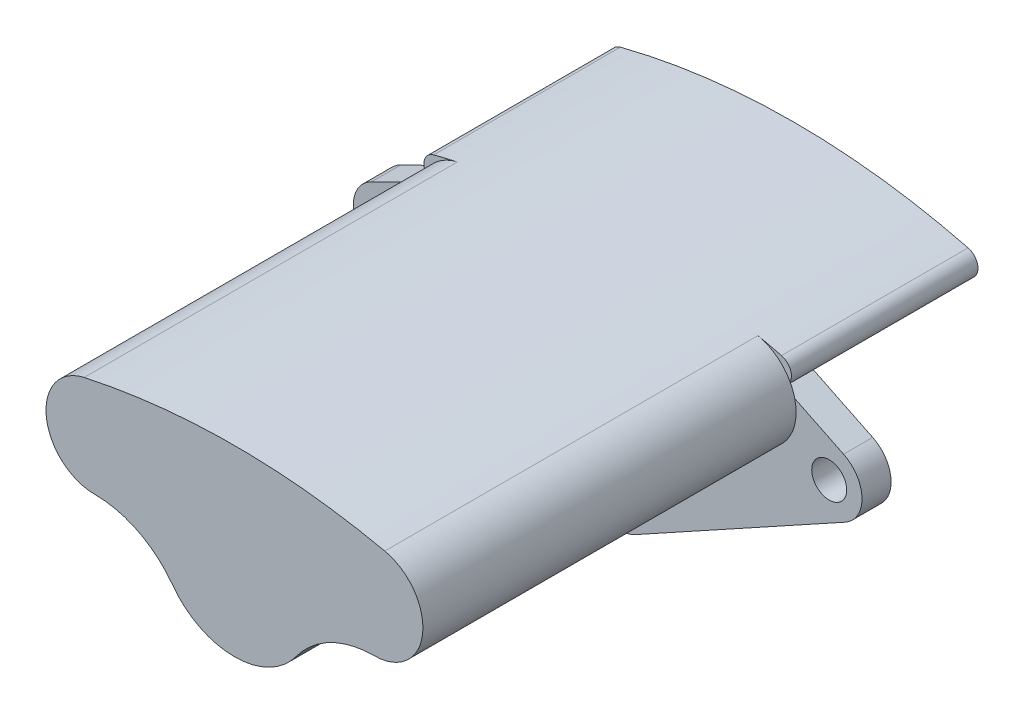
ISO-10303-21;
HEADER;
FILE_DESCRIPTION(('STEP AP214'),'2;1');
FILE_NAME('part.step','',(''),(''),'','','');
FILE_SCHEMA(('AUTOMOTIVE_DESIGN { 1 0 10303 214 1 1 1 1 }'));
ENDSEC;
DATA;
#1=APPLICATION_CONTEXT('core data for automotive mechanical design processes');
#2=APPLICATION_PROTOCOL_DEFINITION('international standard','automotive_design',2000,#1);
#3=PRODUCT_CONTEXT('',#1,'mechanical');
#4=PRODUCT('Part','Part','',(#3));
#5=PRODUCT_RELATED_PRODUCT_CATEGORY('part','',(#4));
#6=PRODUCT_DEFINITION_FORMATION('','',#4);
#7=PRODUCT_DEFINITION_CONTEXT('part definition',#1,'design');
#8=PRODUCT_DEFINITION('design','',#6,#7);
#9=PRODUCT_DEFINITION_SHAPE('','',#8);
#10=(LENGTH_UNIT() NAMED_UNIT(*) SI_UNIT(.MILLI.,.METRE.));
#11=(NAMED_UNIT(*) PLANE_ANGLE_UNIT() SI_UNIT($,.RADIAN.));
#12=(NAMED_UNIT(*) SI_UNIT($,.STERADIAN.) SOLID_ANGLE_UNIT());
#13=UNCERTAINTY_MEASURE_WITH_UNIT(LENGTH_MEASURE(1.E-05),#10,'distance_accuracy_value','');
#14=(GEOMETRIC_REPRESENTATION_CONTEXT(3) GLOBAL_UNCERTAINTY_ASSIGNED_CONTEXT((#13)) GLOBAL_UNIT_ASSIGNED_CONTEXT((#10,
#11,#12)) REPRESENTATION_CONTEXT('',''));
#15=CARTESIAN_POINT('',(0.,0.,0.));
#16=DIRECTION('',(0.,0.,1.));
#17=DIRECTION('',(1.,0.,0.));
#18=AXIS2_PLACEMENT_3D('',#15,#16,#17);
#19=CARTESIAN_POINT('',(64.2346131851022,11.3234732579478,7.9248));
#20=DIRECTION('',(-0.438064147591785,-0.898943714920285,0.));
#21=DIRECTION('',(0.898943714920285,-0.438064147591785,0.));
#22=AXIS2_PLACEMENT_3D('',#19,#20,#21);
#23=PLANE('',#22);
#24=DIRECTION('',(0.,0.,1.));
#25=VECTOR('',#24,1.);
#26=CARTESIAN_POINT('',(47.8255621165623,19.3197658509356,-42.8752));
#27=LINE('',#26,#25);
#28=CARTESIAN_POINT('',(47.8255621165623,19.3197658509356,7.9248));
#29=VERTEX_POINT('',#28);
#30=CARTESIAN_POINT('',(47.8255621165623,19.3197658509356,0.));
#31=VERTEX_POINT('',#30);
#32=EDGE_CURVE('E262',#29,#31,#27,.F.);
#33=ORIENTED_EDGE('',*,*,#32,.F.);
#34=DIRECTION('',(-0.898943714920285,0.438064147591785,0.));
#35=VECTOR('',#34,1.);
#36=CARTESIAN_POINT('',(64.2346131851022,11.3234732579478,7.9248));
#37=LINE('',#36,#35);
#38=CARTESIAN_POINT('',(50.948654549501,17.7978520739346,7.9248));
#39=VERTEX_POINT('',#38);
#40=EDGE_CURVE('E352',#39,#29,#37,.T.);
#41=ORIENTED_EDGE('',*,*,#40,.F.);
#42=CARTESIAN_POINT('',(64.2346131851022,11.3234732579478,7.9248));
#43=VERTEX_POINT('',#42);
#44=EDGE_CURVE('E355',#43,#39,#37,.T.);
#45=ORIENTED_EDGE('',*,*,#44,.F.);
#46=DIRECTION('',(0.,0.,-1.));
#47=VECTOR('',#46,1.);
#48=CARTESIAN_POINT('',(64.2346131851022,11.3234732579478,7.9248));
#49=LINE('',#48,#47);
#50=CARTESIAN_POINT('',(64.2346131851022,11.3234732579478,0.));
#51=VERTEX_POINT('',#50);
#52=EDGE_CURVE('E415',#43,#51,#49,.T.);
#53=ORIENTED_EDGE('',*,*,#52,.T.);
#54=DIRECTION('',(-0.898943714920285,0.438064147591785,0.));
#55=VECTOR('',#54,1.);
#56=CARTESIAN_POINT('',(64.2346131851022,11.3234732579478,0.));
#57=LINE('',#56,#55);
#58=EDGE_CURVE('E384',#51,#31,#57,.T.);
#59=ORIENTED_EDGE('',*,*,#58,.T.);
#60=EDGE_LOOP('',(#33,#41,#45,#53,#59));
#61=FACE_BOUND('',#60,.T.);
#62=ADVANCED_FACE('F43',(#61),#23,.F.);
#63=CARTESIAN_POINT('',(38.1,14.7306249608711,7.9248));
#64=DIRECTION('',(0.,0.,-1.));
#65=DIRECTION('',(-1.,0.,0.));
#66=AXIS2_PLACEMENT_3D('',#63,#64,#65);
#67=CYLINDRICAL_SURFACE('',#66,8.38579943844996);
#68=DIRECTION('',(0.,0.,1.));
#69=VECTOR('',#68,1.);
#70=CARTESIAN_POINT('',(33.5739350474456,21.7901127799106,-17.4752));
#71=LINE('',#70,#69);
#72=CARTESIAN_POINT('',(33.5739350474456,21.7901127799106,0.));
#73=VERTEX_POINT('',#72);
#74=CARTESIAN_POINT('',(33.5739350474456,21.7901127799106,7.9248));
#75=VERTEX_POINT('',#74);
#76=EDGE_CURVE('E265',#73,#75,#71,.T.);
#77=ORIENTED_EDGE('',*,*,#76,.F.);
#78=CARTESIAN_POINT('',(38.1,14.7306249608711,0.));
#79=DIRECTION('',(0.,0.,1.));
#80=DIRECTION('',(1.,0.,0.));
#81=AXIS2_PLACEMENT_3D('',#78,#79,#80);
#82=CIRCLE('',#81,8.38579943844996);
#83=CARTESIAN_POINT('',(30.4611324593754,18.1902976214994,0.));
#84=VERTEX_POINT('',#83);
#85=EDGE_CURVE('E387',#73,#84,#82,.T.);
#86=ORIENTED_EDGE('',*,*,#85,.T.);
#87=DIRECTION('',(0.,0.,-1.));
#88=VECTOR('',#87,1.);
#89=CARTESIAN_POINT('',(30.4611324593754,18.1902976214994,7.9248));
#90=LINE('',#89,#88);
#91=CARTESIAN_POINT('',(30.4611324593754,18.1902976214994,7.9248));
#92=VERTEX_POINT('',#91);
#93=EDGE_CURVE('E406',#92,#84,#90,.T.);
#94=ORIENTED_EDGE('',*,*,#93,.F.);
#95=CARTESIAN_POINT('',(38.1,14.7306249608711,7.9248));
#96=DIRECTION('',(0.,0.,1.));
#97=DIRECTION('',(1.,0.,0.));
#98=AXIS2_PLACEMENT_3D('',#95,#96,#97);
#99=CIRCLE('',#98,8.38579943844996);
#100=EDGE_CURVE('E351',#75,#92,#99,.T.);
#101=ORIENTED_EDGE('',*,*,#100,.F.);
#102=EDGE_LOOP('',(#77,#86,#94,#101));
#103=FACE_BOUND('',#102,.T.);
#104=ADVANCED_FACE('F517',(#103),#67,.T.);
#105=CARTESIAN_POINT('',(-38.1,14.7306249608711,7.9248));
#106=DIRECTION('',(0.,0.,-1.));
#107=DIRECTION('',(-1.,0.,0.));
#108=AXIS2_PLACEMENT_3D('',#105,#106,#107);
#109=CYLINDRICAL_SURFACE('',#108,8.38579943844996);
#110=DIRECTION('',(0.,0.,1.));
#111=VECTOR('',#110,1.);
#112=CARTESIAN_POINT('',(-33.5739350474456,21.7901127799106,-17.4752));
#113=LINE('',#112,#111);
#114=CARTESIAN_POINT('',(-33.5739350474456,21.7901127799106,7.9248));
#115=VERTEX_POINT('',#114);
#116=CARTESIAN_POINT('',(-33.5739350474456,21.7901127799106,0.));
#117=VERTEX_POINT('',#116);
#118=EDGE_CURVE('E256',#115,#117,#113,.F.);
#119=ORIENTED_EDGE('',*,*,#118,.F.);
#120=CARTESIAN_POINT('',(-38.1,14.7306249608711,7.9248));
#121=DIRECTION('',(0.,0.,1.));
#122=DIRECTION('',(-1.,0.,0.));
#123=AXIS2_PLACEMENT_3D('',#120,#121,#122);
#124=CIRCLE('',#123,8.38579943844996);
#125=CARTESIAN_POINT('',(-30.4611324593754,18.1902976214994,7.9248));
#126=VERTEX_POINT('',#125);
#127=EDGE_CURVE('E366',#126,#115,#124,.T.);
#128=ORIENTED_EDGE('',*,*,#127,.F.);
#129=DIRECTION('',(0.,0.,-1.));
#130=VECTOR('',#129,1.);
#131=CARTESIAN_POINT('',(-30.4611324593754,18.1902976214994,7.9248));
#132=LINE('',#131,#130);
#133=CARTESIAN_POINT('',(-30.4611324593754,18.1902976214994,0.));
#134=VERTEX_POINT('',#133);
#135=EDGE_CURVE('E396',#126,#134,#132,.T.);
#136=ORIENTED_EDGE('',*,*,#135,.T.);
#137=CARTESIAN_POINT('',(-38.1,14.7306249608711,0.));
#138=DIRECTION('',(0.,0.,1.));
#139=DIRECTION('',(-1.,0.,0.));
#140=AXIS2_PLACEMENT_3D('',#137,#138,#139);
#141=CIRCLE('',#140,8.38579943844996);
#142=EDGE_CURVE('E394',#134,#117,#141,.T.);
#143=ORIENTED_EDGE('',*,*,#142,.T.);
#144=EDGE_LOOP('',(#119,#128,#136,#143));
#145=FACE_BOUND('',#144,.T.);
#146=ADVANCED_FACE('F440',(#145),#109,.T.);
#147=CARTESIAN_POINT('',(-64.2346131851022,11.3234732579478,7.9248));
#148=DIRECTION('',(0.438064147591785,-0.898943714920285,0.));
#149=DIRECTION('',(0.898943714920285,0.438064147591785,0.));
#150=AXIS2_PLACEMENT_3D('',#147,#148,#149);
#151=PLANE('',#150);
#152=DIRECTION('',(0.,0.,1.));
#153=VECTOR('',#152,1.);
#154=CARTESIAN_POINT('',(-47.8255621165623,19.3197658509356,-42.8752));
#155=LINE('',#154,#153);
#156=CARTESIAN_POINT('',(-47.8255621165623,19.3197658509356,0.));
#157=VERTEX_POINT('',#156);
#158=CARTESIAN_POINT('',(-47.8255621165623,19.3197658509356,7.9248));
#159=VERTEX_POINT('',#158);
#160=EDGE_CURVE('E249',#157,#159,#155,.T.);
#161=ORIENTED_EDGE('',*,*,#160,.F.);
#162=DIRECTION('',(-0.898943714920285,-0.438064147591785,0.));
#163=VECTOR('',#162,1.);
#164=CARTESIAN_POINT('',(-64.2346131851022,11.3234732579478,0.));
#165=LINE('',#164,#163);
#166=CARTESIAN_POINT('',(-64.2346131851022,11.3234732579478,0.));
#167=VERTEX_POINT('',#166);
#168=EDGE_CURVE('E344',#157,#167,#165,.T.);
#169=ORIENTED_EDGE('',*,*,#168,.T.);
#170=DIRECTION('',(0.,0.,-1.));
#171=VECTOR('',#170,1.);
#172=CARTESIAN_POINT('',(-64.2346131851022,11.3234732579478,7.9248));
#173=LINE('',#172,#171);
#174=CARTESIAN_POINT('',(-64.2346131851022,11.3234732579478,7.9248));
#175=VERTEX_POINT('',#174);
#176=EDGE_CURVE('E375',#175,#167,#173,.T.);
#177=ORIENTED_EDGE('',*,*,#176,.F.);
#178=DIRECTION('',(-0.898943714920285,-0.438064147591785,0.));
#179=VECTOR('',#178,1.);
#180=CARTESIAN_POINT('',(-64.2346131851022,11.3234732579478,7.9248));
#181=LINE('',#180,#179);
#182=CARTESIAN_POINT('',(-50.948654549501,17.7978520739346,7.9248));
#183=VERTEX_POINT('',#182);
#184=EDGE_CURVE('E367',#183,#175,#181,.T.);
#185=ORIENTED_EDGE('',*,*,#184,.F.);
#186=EDGE_CURVE('E369',#159,#183,#181,.T.);
#187=ORIENTED_EDGE('',*,*,#186,.F.);
#188=EDGE_LOOP('',(#161,#169,#177,#185,#187));
#189=FACE_BOUND('',#188,.T.);
#190=ADVANCED_FACE('F533',(#189),#151,.F.);
#191=CARTESIAN_POINT('',(-38.0701414873198,-5.00163867781075,7.9248));
#192=DIRECTION('',(0.,0.,1.));
#193=DIRECTION('',(1.,0.,0.));
#194=AXIS2_PLACEMENT_3D('',#191,#192,#193);
#195=PLANE('',#194);
#196=CARTESIAN_POINT('',(46.4388281649053,22.6347021845761,7.9248));
#197=DIRECTION('',(0.,0.,1.));
#198=DIRECTION('',(1.,0.,0.));
#199=AXIS2_PLACEMENT_3D('',#196,#197,#198);
#200=CIRCLE('',#199,3.59330404346313);
#201=CARTESIAN_POINT('',(49.6808459386615,21.0851362119834,7.9248));
#202=VERTEX_POINT('',#201);
#203=EDGE_CURVE('E11',#202,#29,#200,.F.);
#204=ORIENTED_EDGE('',*,*,#203,.F.);
#205=CARTESIAN_POINT('',(38.1,14.7306249608711,7.9248));
#206=DIRECTION('',(0.,0.,1.));
#207=DIRECTION('',(-1.,0.,0.));
#208=AXIS2_PLACEMENT_3D('',#205,#206,#207);
#209=CIRCLE('',#208,13.2096860634735);
#210=EDGE_CURVE('E298',#39,#202,#209,.T.);
#211=ORIENTED_EDGE('',*,*,#210,.F.);
#212=ORIENTED_EDGE('',*,*,#40,.T.);
#213=EDGE_LOOP('',(#204,#211,#212));
#214=FACE_BOUND('',#213,.T.);
#215=ADVANCED_FACE('F497',(#214),#195,.F.);
#216=CARTESIAN_POINT('',(0.,-159.197568550565,7.9248));
#217=DIRECTION('',(0.,0.,1.));
#218=DIRECTION('',(1.,0.,0.));
#219=AXIS2_PLACEMENT_3D('',#216,#217,#218);
#220=CIRCLE('',#219,184.075391913074);
#221=EDGE_CURVE('E51',#75,#115,#220,.T.);
#222=ORIENTED_EDGE('',*,*,#221,.F.);
#223=ORIENTED_EDGE('',*,*,#100,.T.);
#224=DIRECTION('',(-0.41256324886155,-0.910928957542136,0.));
#225=VECTOR('',#224,1.);
#226=CARTESIAN_POINT('',(30.4611324593754,18.1902976214994,7.9248));
#227=LINE('',#226,#225);
#228=CARTESIAN_POINT('',(19.3899277946436,-6.25463525075486,7.9248));
#229=VERTEX_POINT('',#228);
#230=EDGE_CURVE('E356',#92,#229,#227,.T.);
#231=ORIENTED_EDGE('',*,*,#230,.T.);
#232=CARTESIAN_POINT('',(38.0402829746396,-24.7339023164926,7.9248));
#233=DIRECTION('',(0.,0.,-1.));
#234=DIRECTION('',(1.,0.,0.));
#235=AXIS2_PLACEMENT_3D('',#232,#233,#234);
#236=CIRCLE('',#235,26.2548863952382);
#237=CARTESIAN_POINT('',(16.8662322023074,-9.21041580354835,7.9248));
#238=VERTEX_POINT('',#237);
#239=EDGE_CURVE('E289',#238,#229,#236,.T.);
#240=ORIENTED_EDGE('',*,*,#239,.F.);
#241=CARTESIAN_POINT('',(0.,3.15484821380376,7.9248));
#242=DIRECTION('',(0.,0.,1.));
#243=DIRECTION('',(-1.,0.,0.));
#244=AXIS2_PLACEMENT_3D('',#241,#242,#243);
#245=CIRCLE('',#244,20.9133819101784);
#246=CARTESIAN_POINT('',(-16.8662322023074,-9.21041580354834,7.9248));
#247=VERTEX_POINT('',#246);
#248=EDGE_CURVE('E290',#247,#238,#245,.T.);
#249=ORIENTED_EDGE('',*,*,#248,.F.);
#250=CARTESIAN_POINT('',(-38.0402829746396,-24.7339023164926,7.9248));
#251=DIRECTION('',(0.,0.,-1.));
#252=DIRECTION('',(-1.,0.,0.));
#253=AXIS2_PLACEMENT_3D('',#250,#251,#252);
#254=CIRCLE('',#253,26.2548863952382);
#255=CARTESIAN_POINT('',(-19.3899277946436,-6.2546352507549,7.9248));
#256=VERTEX_POINT('',#255);
#257=EDGE_CURVE('E284',#256,#247,#254,.T.);
#258=ORIENTED_EDGE('',*,*,#257,.F.);
#259=DIRECTION('',(-0.412563248861551,0.910928957542136,0.));
#260=VECTOR('',#259,1.);
#261=CARTESIAN_POINT('',(-30.4611324593754,18.1902976214994,7.9248));
#262=LINE('',#261,#260);
#263=EDGE_CURVE('E361',#256,#126,#262,.T.);
#264=ORIENTED_EDGE('',*,*,#263,.T.);
#265=ORIENTED_EDGE('',*,*,#127,.T.);
#266=EDGE_LOOP('',(#222,#223,#231,#240,#249,#258,#264,#265));
#267=FACE_BOUND('',#266,.T.);
#268=ADVANCED_FACE('F439',(#267),#195,.F.);
#269=CARTESIAN_POINT('',(-46.4388281649053,22.6347021845761,7.9248));
#270=DIRECTION('',(0.,0.,1.));
#271=DIRECTION('',(1.,0.,0.));
#272=AXIS2_PLACEMENT_3D('',#269,#270,#271);
#273=CIRCLE('',#272,3.59330404346313);
#274=CARTESIAN_POINT('',(-49.6808459386615,21.0851362119834,7.9248));
#275=VERTEX_POINT('',#274);
#276=EDGE_CURVE('E430',#159,#275,#273,.F.);
#277=ORIENTED_EDGE('',*,*,#276,.F.);
#278=ORIENTED_EDGE('',*,*,#186,.T.);
#279=CARTESIAN_POINT('',(-38.1,14.7306249608711,7.9248));
#280=DIRECTION('',(0.,0.,1.));
#281=DIRECTION('',(1.,0.,0.));
#282=AXIS2_PLACEMENT_3D('',#279,#280,#281);
#283=CIRCLE('',#282,13.2096860634735);
#284=EDGE_CURVE('E63',#275,#183,#283,.T.);
#285=ORIENTED_EDGE('',*,*,#284,.F.);
#286=EDGE_LOOP('',(#277,#278,#285));
#287=FACE_BOUND('',#286,.T.);
#288=ADVANCED_FACE('F581',(#287),#195,.F.);
#289=CARTESIAN_POINT('',(-60.325,3.3006249608711,7.9248));
#290=DIRECTION('',(0.,0.,1.));
#291=DIRECTION('',(1.,0.,0.));
#292=AXIS2_PLACEMENT_3D('',#289,#290,#291);
#293=PLANE('',#292);
#294=CARTESIAN_POINT('',(60.325,3.3006249608711,7.9248));
#295=DIRECTION('',(0.,0.,1.));
#296=DIRECTION('',(-1.,0.,0.));
#297=AXIS2_PLACEMENT_3D('',#294,#295,#296);
#298=CIRCLE('',#297,4.7625);
#299=CARTESIAN_POINT('',(55.5625,3.3006249608711,7.9248));
#300=VERTEX_POINT('',#299);
#301=EDGE_CURVE('E334',#300,#300,#298,.T.);
#302=ORIENTED_EDGE('',*,*,#301,.F.);
#303=EDGE_LOOP('',(#302));
#304=FACE_BOUND('',#303,.T.);
#305=CARTESIAN_POINT('',(-60.325,3.3006249608711,7.9248));
#306=DIRECTION('',(0.,0.,1.));
#307=DIRECTION('',(1.,0.,0.));
#308=AXIS2_PLACEMENT_3D('',#305,#306,#307);
#309=CIRCLE('',#308,4.7625);
#310=CARTESIAN_POINT('',(-55.5625,3.3006249608711,7.9248));
#311=VERTEX_POINT('',#310);
#312=EDGE_CURVE('E316',#311,#311,#309,.T.);
#313=ORIENTED_EDGE('',*,*,#312,.F.);
#314=EDGE_LOOP('',(#313));
#315=FACE_BOUND('',#314,.T.);
#316=CARTESIAN_POINT('',(38.0800113593406,1.52095402061793,7.9248));
#317=VERTEX_POINT('',#316);
#318=EDGE_CURVE('E272',#317,#39,#209,.T.);
#319=ORIENTED_EDGE('',*,*,#318,.F.);
#320=EDGE_CURVE('E291',#229,#317,#236,.T.);
#321=ORIENTED_EDGE('',*,*,#320,.F.);
#322=CARTESIAN_POINT('',(18.4401893576134,-8.35163309719162,7.9248));
#323=VERTEX_POINT('',#322);
#324=EDGE_CURVE('E357',#229,#323,#227,.T.);
#325=ORIENTED_EDGE('',*,*,#324,.T.);
#326=CARTESIAN_POINT('',(0.,0.,7.9248));
#327=DIRECTION('',(0.,0.,-1.));
#328=DIRECTION('',(1.,0.,0.));
#329=AXIS2_PLACEMENT_3D('',#326,#327,#328);
#330=CIRCLE('',#329,20.2432793522874);
#331=CARTESIAN_POINT('',(-18.4401893576134,-8.35163309719163,7.9248));
#332=VERTEX_POINT('',#331);
#333=EDGE_CURVE('E363',#323,#332,#330,.T.);
#334=ORIENTED_EDGE('',*,*,#333,.T.);
#335=EDGE_CURVE('E364',#332,#256,#262,.T.);
#336=ORIENTED_EDGE('',*,*,#335,.T.);
#337=CARTESIAN_POINT('',(-38.0800113593406,1.52095402061792,7.9248));
#338=VERTEX_POINT('',#337);
#339=EDGE_CURVE('E59',#338,#256,#254,.T.);
#340=ORIENTED_EDGE('',*,*,#339,.F.);
#341=EDGE_CURVE('E282',#183,#338,#283,.T.);
#342=ORIENTED_EDGE('',*,*,#341,.F.);
#343=ORIENTED_EDGE('',*,*,#184,.T.);
#344=CARTESIAN_POINT('',(-60.325,3.3006249608711,7.9248));
#345=DIRECTION('',(0.,0.,1.));
#346=DIRECTION('',(1.,0.,0.));
#347=AXIS2_PLACEMENT_3D('',#344,#345,#346);
#348=CIRCLE('',#347,8.9247504197614);
#349=CARTESIAN_POINT('',(-64.6332481893229,-4.51539497220399,7.9248));
#350=VERTEX_POINT('',#349);
#351=EDGE_CURVE('E339',#175,#350,#348,.T.);
#352=ORIENTED_EDGE('',*,*,#351,.T.);
#353=DIRECTION('',(0.875769020472401,-0.482730383113401,0.));
#354=VECTOR('',#353,1.);
#355=CARTESIAN_POINT('',(-64.6332481893229,-4.51539497220399,7.9248));
#356=LINE('',#355,#354);
#357=CARTESIAN_POINT('',(-8.10916546716794,-35.6718888304602,7.9248));
#358=VERTEX_POINT('',#357);
#359=EDGE_CURVE('E345',#350,#358,#356,.T.);
#360=ORIENTED_EDGE('',*,*,#359,.T.);
#361=CARTESIAN_POINT('',(0.,-20.9602482408892,7.9248));
#362=DIRECTION('',(0.,0.,1.));
#363=DIRECTION('',(1.,0.,0.));
#364=AXIS2_PLACEMENT_3D('',#361,#362,#363);
#365=CIRCLE('',#364,16.7985396213666);
#366=CARTESIAN_POINT('',(8.10916546716794,-35.6718888304602,7.9248));
#367=VERTEX_POINT('',#366);
#368=EDGE_CURVE('E343',#358,#367,#365,.T.);
#369=ORIENTED_EDGE('',*,*,#368,.T.);
#370=DIRECTION('',(0.875769020472401,0.482730383113401,0.));
#371=VECTOR('',#370,1.);
#372=CARTESIAN_POINT('',(64.6332481893229,-4.51539497220397,7.9248));
#373=LINE('',#372,#371);
#374=CARTESIAN_POINT('',(64.6332481893229,-4.51539497220397,7.9248));
#375=VERTEX_POINT('',#374);
#376=EDGE_CURVE('E350',#367,#375,#373,.T.);
#377=ORIENTED_EDGE('',*,*,#376,.T.);
#378=CARTESIAN_POINT('',(60.325,3.30062496087112,7.9248));
#379=DIRECTION('',(0.,0.,1.));
#380=DIRECTION('',(-1.,0.,0.));
#381=AXIS2_PLACEMENT_3D('',#378,#379,#380);
#382=CIRCLE('',#381,8.9247504197614);
#383=EDGE_CURVE('E349',#375,#43,#382,.T.);
#384=ORIENTED_EDGE('',*,*,#383,.T.);
#385=ORIENTED_EDGE('',*,*,#44,.T.);
#386=EDGE_LOOP('',(#319,#321,#325,#334,#336,#340,#342,#343,#352,#360,#369,#377,#384,#385));
#387=FACE_BOUND('',#386,.T.);
#388=ADVANCED_FACE('F505',(#304,#315,#387),#293,.T.);
#389=CARTESIAN_POINT('',(-60.325,3.3006249608711,7.9248));
#390=DIRECTION('',(0.,0.,-1.));
#391=DIRECTION('',(-1.,0.,0.));
#392=AXIS2_PLACEMENT_3D('',#389,#390,#391);
#393=CYLINDRICAL_SURFACE('',#392,8.9247504197614);
#394=CARTESIAN_POINT('',(-60.325,3.3006249608711,0.));
#395=DIRECTION('',(0.,0.,1.));
#396=DIRECTION('',(1.,0.,0.));
#397=AXIS2_PLACEMENT_3D('',#394,#395,#396);
#398=CIRCLE('',#397,8.9247504197614);
#399=CARTESIAN_POINT('',(-64.6332481893229,-4.51539497220399,0.));
#400=VERTEX_POINT('',#399);
#401=EDGE_CURVE('E319',#167,#400,#398,.T.);
#402=ORIENTED_EDGE('',*,*,#401,.T.);
#403=DIRECTION('',(0.,0.,-1.));
#404=VECTOR('',#403,1.);
#405=CARTESIAN_POINT('',(-64.6332481893229,-4.51539497220399,7.9248));
#406=LINE('',#405,#404);
#407=EDGE_CURVE('E425',#350,#400,#406,.T.);
#408=ORIENTED_EDGE('',*,*,#407,.F.);
#409=ORIENTED_EDGE('',*,*,#351,.F.);
#410=ORIENTED_EDGE('',*,*,#176,.T.);
#411=EDGE_LOOP('',(#402,#408,#409,#410));
#412=FACE_BOUND('',#411,.T.);
#413=ADVANCED_FACE('F44',(#412),#393,.T.);
#414=CARTESIAN_POINT('',(-64.6332481893229,-4.51539497220399,7.9248));
#415=DIRECTION('',(0.482730383113401,0.875769020472401,0.));
#416=DIRECTION('',(-0.875769020472401,0.482730383113401,0.));
#417=AXIS2_PLACEMENT_3D('',#414,#415,#416);
#418=PLANE('',#417);
#419=DIRECTION('',(0.875769020472401,-0.482730383113401,0.));
#420=VECTOR('',#419,1.);
#421=CARTESIAN_POINT('',(-64.6332481893229,-4.51539497220399,0.));
#422=LINE('',#421,#420);
#423=CARTESIAN_POINT('',(-8.10916546716794,-35.6718888304602,0.));
#424=VERTEX_POINT('',#423);
#425=EDGE_CURVE('E374',#400,#424,#422,.T.);
#426=ORIENTED_EDGE('',*,*,#425,.T.);
#427=DIRECTION('',(0.,0.,-1.));
#428=VECTOR('',#427,1.);
#429=CARTESIAN_POINT('',(-8.10916546716794,-35.6718888304602,7.9248));
#430=LINE('',#429,#428);
#431=EDGE_CURVE('E423',#358,#424,#430,.T.);
#432=ORIENTED_EDGE('',*,*,#431,.F.);
#433=ORIENTED_EDGE('',*,*,#359,.F.);
#434=ORIENTED_EDGE('',*,*,#407,.T.);
#435=EDGE_LOOP('',(#426,#432,#433,#434));
#436=FACE_BOUND('',#435,.T.);
#437=ADVANCED_FACE('F544',(#436),#418,.F.);
#438=CARTESIAN_POINT('',(0.,-20.9602482408892,7.9248));
#439=DIRECTION('',(0.,0.,-1.));
#440=DIRECTION('',(-1.,0.,0.));
#441=AXIS2_PLACEMENT_3D('',#438,#439,#440);
#442=CYLINDRICAL_SURFACE('',#441,16.7985396213666);
#443=CARTESIAN_POINT('',(0.,-20.9602482408892,0.));
#444=DIRECTION('',(0.,0.,1.));
#445=DIRECTION('',(1.,0.,0.));
#446=AXIS2_PLACEMENT_3D('',#443,#444,#445);
#447=CIRCLE('',#446,16.7985396213666);
#448=CARTESIAN_POINT('',(8.10916546716794,-35.6718888304602,0.));
#449=VERTEX_POINT('',#448);
#450=EDGE_CURVE('E380',#424,#449,#447,.T.);
#451=ORIENTED_EDGE('',*,*,#450,.T.);
#452=DIRECTION('',(0.,0.,-1.));
#453=VECTOR('',#452,1.);
#454=CARTESIAN_POINT('',(8.10916546716794,-35.6718888304602,7.9248));
#455=LINE('',#454,#453);
#456=EDGE_CURVE('E418',#367,#449,#455,.T.);
#457=ORIENTED_EDGE('',*,*,#456,.F.);
#458=ORIENTED_EDGE('',*,*,#368,.F.);
#459=ORIENTED_EDGE('',*,*,#431,.T.);
#460=EDGE_LOOP('',(#451,#457,#458,#459));
#461=FACE_BOUND('',#460,.T.);
#462=ADVANCED_FACE('F550',(#461),#442,.T.);
#463=CARTESIAN_POINT('',(64.6332481893229,-4.51539497220397,7.9248));
#464=DIRECTION('',(-0.482730383113401,0.875769020472401,0.));
#465=DIRECTION('',(-0.875769020472401,-0.482730383113401,0.));
#466=AXIS2_PLACEMENT_3D('',#463,#464,#465);
#467=PLANE('',#466);
#468=DIRECTION('',(0.875769020472401,0.482730383113401,0.));
#469=VECTOR('',#468,1.);
#470=CARTESIAN_POINT('',(64.6332481893229,-4.51539497220397,0.));
#471=LINE('',#470,#469);
#472=CARTESIAN_POINT('',(64.6332481893229,-4.51539497220397,0.));
#473=VERTEX_POINT('',#472);
#474=EDGE_CURVE('E378',#449,#473,#471,.T.);
#475=ORIENTED_EDGE('',*,*,#474,.T.);
#476=DIRECTION('',(0.,0.,-1.));
#477=VECTOR('',#476,1.);
#478=CARTESIAN_POINT('',(64.6332481893229,-4.51539497220397,7.9248));
#479=LINE('',#478,#477);
#480=EDGE_CURVE('E412',#375,#473,#479,.T.);
#481=ORIENTED_EDGE('',*,*,#480,.F.);
#482=ORIENTED_EDGE('',*,*,#376,.F.);
#483=ORIENTED_EDGE('',*,*,#456,.T.);
#484=EDGE_LOOP('',(#475,#481,#482,#483));
#485=FACE_BOUND('',#484,.T.);
#486=ADVANCED_FACE('F549',(#485),#467,.F.);
#487=CARTESIAN_POINT('',(60.325,3.30062496087112,7.9248));
#488=DIRECTION('',(0.,0.,-1.));
#489=DIRECTION('',(-1.,0.,0.));
#490=AXIS2_PLACEMENT_3D('',#487,#488,#489);
#491=CYLINDRICAL_SURFACE('',#490,8.9247504197614);
#492=CARTESIAN_POINT('',(60.325,3.30062496087112,0.));
#493=DIRECTION('',(0.,0.,1.));
#494=DIRECTION('',(-1.,0.,0.));
#495=AXIS2_PLACEMENT_3D('',#492,#493,#494);
#496=CIRCLE('',#495,8.9247504197614);
#497=EDGE_CURVE('E382',#473,#51,#496,.T.);
#498=ORIENTED_EDGE('',*,*,#497,.T.);
#499=ORIENTED_EDGE('',*,*,#52,.F.);
#500=ORIENTED_EDGE('',*,*,#383,.F.);
#501=ORIENTED_EDGE('',*,*,#480,.T.);
#502=EDGE_LOOP('',(#498,#499,#500,#501));
#503=FACE_BOUND('',#502,.T.);
#504=ADVANCED_FACE('F508',(#503),#491,.T.);
#505=CARTESIAN_POINT('',(30.4611324593754,18.1902976214994,7.9248));
#506=DIRECTION('',(0.910928957542136,-0.41256324886155,0.));
#507=DIRECTION('',(0.41256324886155,0.910928957542136,0.));
#508=AXIS2_PLACEMENT_3D('',#505,#506,#507);
#509=PLANE('',#508);
#510=DIRECTION('',(-0.41256324886155,-0.910928957542136,0.));
#511=VECTOR('',#510,1.);
#512=CARTESIAN_POINT('',(30.4611324593754,18.1902976214994,0.));
#513=LINE('',#512,#511);
#514=CARTESIAN_POINT('',(18.4401893576134,-8.35163309719162,0.));
#515=VERTEX_POINT('',#514);
#516=EDGE_CURVE('E389',#84,#515,#513,.T.);
#517=ORIENTED_EDGE('',*,*,#516,.T.);
#518=DIRECTION('',(0.,0.,-1.));
#519=VECTOR('',#518,1.);
#520=CARTESIAN_POINT('',(18.4401893576134,-8.35163309719162,7.9248));
#521=LINE('',#520,#519);
#522=EDGE_CURVE('E407',#323,#515,#521,.T.);
#523=ORIENTED_EDGE('',*,*,#522,.F.);
#524=ORIENTED_EDGE('',*,*,#324,.F.);
#525=ORIENTED_EDGE('',*,*,#230,.F.);
#526=ORIENTED_EDGE('',*,*,#93,.T.);
#527=EDGE_LOOP('',(#517,#523,#524,#525,#526));
#528=FACE_BOUND('',#527,.T.);
#529=ADVANCED_FACE('F558',(#528),#509,.F.);
#530=CARTESIAN_POINT('',(0.,0.,7.9248));
#531=DIRECTION('',(0.,0.,-1.));
#532=DIRECTION('',(-1.,0.,0.));
#533=AXIS2_PLACEMENT_3D('',#530,#531,#532);
#534=CYLINDRICAL_SURFACE('',#533,20.2432793522874);
#535=CARTESIAN_POINT('',(0.,0.,0.));
#536=DIRECTION('',(0.,0.,-1.));
#537=DIRECTION('',(1.,0.,0.));
#538=AXIS2_PLACEMENT_3D('',#535,#536,#537);
#539=CIRCLE('',#538,20.2432793522874);
#540=CARTESIAN_POINT('',(-18.4401893576134,-8.35163309719163,0.));
#541=VERTEX_POINT('',#540);
#542=EDGE_CURVE('E388',#515,#541,#539,.T.);
#543=ORIENTED_EDGE('',*,*,#542,.T.);
#544=DIRECTION('',(0.,0.,-1.));
#545=VECTOR('',#544,1.);
#546=CARTESIAN_POINT('',(-18.4401893576134,-8.35163309719163,7.9248));
#547=LINE('',#546,#545);
#548=EDGE_CURVE('E401',#332,#541,#547,.T.);
#549=ORIENTED_EDGE('',*,*,#548,.F.);
#550=ORIENTED_EDGE('',*,*,#333,.F.);
#551=ORIENTED_EDGE('',*,*,#522,.T.);
#552=EDGE_LOOP('',(#543,#549,#550,#551));
#553=FACE_BOUND('',#552,.T.);
#554=ADVANCED_FACE('F567',(#553),#534,.F.);
#555=CARTESIAN_POINT('',(-30.4611324593754,18.1902976214994,7.9248));
#556=DIRECTION('',(-0.910928957542136,-0.41256324886155,0.));
#557=DIRECTION('',(0.41256324886155,-0.910928957542136,0.));
#558=AXIS2_PLACEMENT_3D('',#555,#556,#557);
#559=PLANE('',#558);
#560=DIRECTION('',(-0.412563248861551,0.910928957542136,0.));
#561=VECTOR('',#560,1.);
#562=CARTESIAN_POINT('',(-30.4611324593754,18.1902976214994,0.));
#563=LINE('',#562,#561);
#564=EDGE_CURVE('E395',#541,#134,#563,.T.);
#565=ORIENTED_EDGE('',*,*,#564,.T.);
#566=ORIENTED_EDGE('',*,*,#135,.F.);
#567=ORIENTED_EDGE('',*,*,#263,.F.);
#568=ORIENTED_EDGE('',*,*,#335,.F.);
#569=ORIENTED_EDGE('',*,*,#548,.T.);
#570=EDGE_LOOP('',(#565,#566,#567,#568,#569));
#571=FACE_BOUND('',#570,.T.);
#572=ADVANCED_FACE('F447',(#571),#559,.F.);
#573=CARTESIAN_POINT('',(-60.325,3.3006249608711,0.));
#574=DIRECTION('',(0.,0.,1.));
#575=DIRECTION('',(1.,0.,0.));
#576=AXIS2_PLACEMENT_3D('',#573,#574,#575);
#577=PLANE('',#576);
#578=CARTESIAN_POINT('',(46.4388281649053,22.6347021845761,0.));
#579=DIRECTION('',(0.,0.,1.));
#580=DIRECTION('',(1.,0.,0.));
#581=AXIS2_PLACEMENT_3D('',#578,#579,#580);
#582=CIRCLE('',#581,3.59330404346313);
#583=CARTESIAN_POINT('',(45.5496610709042,19.1531485331564,0.));
#584=VERTEX_POINT('',#583);
#585=EDGE_CURVE('E250',#31,#584,#582,.F.);
#586=ORIENTED_EDGE('',*,*,#585,.F.);
#587=ORIENTED_EDGE('',*,*,#58,.F.);
#588=ORIENTED_EDGE('',*,*,#497,.F.);
#589=ORIENTED_EDGE('',*,*,#474,.F.);
#590=ORIENTED_EDGE('',*,*,#450,.F.);
#591=ORIENTED_EDGE('',*,*,#425,.F.);
#592=ORIENTED_EDGE('',*,*,#401,.F.);
#593=ORIENTED_EDGE('',*,*,#168,.F.);
#594=CARTESIAN_POINT('',(-46.4388281649053,22.6347021845761,0.));
#595=DIRECTION('',(0.,0.,1.));
#596=DIRECTION('',(1.,0.,0.));
#597=AXIS2_PLACEMENT_3D('',#594,#595,#596);
#598=CIRCLE('',#597,3.59330404346313);
#599=CARTESIAN_POINT('',(-45.5496610709042,19.1531485331564,0.));
#600=VERTEX_POINT('',#599);
#601=EDGE_CURVE('E247',#600,#157,#598,.F.);
#602=ORIENTED_EDGE('',*,*,#601,.F.);
#603=CARTESIAN_POINT('',(0.,-159.197568550565,0.));
#604=DIRECTION('',(0.,0.,1.));
#605=DIRECTION('',(1.,0.,0.));
#606=AXIS2_PLACEMENT_3D('',#603,#604,#605);
#607=CIRCLE('',#606,184.075391913074);
#608=EDGE_CURVE('E260',#117,#600,#607,.T.);
#609=ORIENTED_EDGE('',*,*,#608,.F.);
#610=ORIENTED_EDGE('',*,*,#142,.F.);
#611=ORIENTED_EDGE('',*,*,#564,.F.);
#612=ORIENTED_EDGE('',*,*,#542,.F.);
#613=ORIENTED_EDGE('',*,*,#516,.F.);
#614=ORIENTED_EDGE('',*,*,#85,.F.);
#615=EDGE_CURVE('E258',#584,#73,#607,.T.);
#616=ORIENTED_EDGE('',*,*,#615,.F.);
#617=EDGE_LOOP('',(#586,#587,#588,#589,#590,#591,#592,#593,#602,#609,#610,#611,#612,#613,#614,#616));
#618=FACE_BOUND('',#617,.T.);
#619=CARTESIAN_POINT('',(60.325,3.3006249608711,0.));
#620=DIRECTION('',(0.,0.,1.));
#621=DIRECTION('',(-1.,0.,0.));
#622=AXIS2_PLACEMENT_3D('',#619,#620,#621);
#623=CIRCLE('',#622,4.7625);
#624=CARTESIAN_POINT('',(55.5625,3.3006249608711,0.));
#625=VERTEX_POINT('',#624);
#626=EDGE_CURVE('E332',#625,#625,#623,.T.);
#627=ORIENTED_EDGE('',*,*,#626,.T.);
#628=EDGE_LOOP('',(#627));
#629=FACE_BOUND('',#628,.T.);
#630=CARTESIAN_POINT('',(38.1,14.7306249608711,0.));
#631=DIRECTION('',(0.,0.,1.));
#632=DIRECTION('',(-1.,0.,0.));
#633=AXIS2_PLACEMENT_3D('',#630,#631,#632);
#634=CIRCLE('',#633,4.7625);
#635=CARTESIAN_POINT('',(33.3375,14.7306249608711,0.));
#636=VERTEX_POINT('',#635);
#637=EDGE_CURVE('E323',#636,#636,#634,.T.);
#638=ORIENTED_EDGE('',*,*,#637,.T.);
#639=EDGE_LOOP('',(#638));
#640=FACE_BOUND('',#639,.T.);
#641=CARTESIAN_POINT('',(-38.1,14.7306249608711,0.));
#642=DIRECTION('',(0.,0.,1.));
#643=DIRECTION('',(1.,0.,0.));
#644=AXIS2_PLACEMENT_3D('',#641,#642,#643);
#645=CIRCLE('',#644,4.7625);
#646=CARTESIAN_POINT('',(-33.3375,14.7306249608711,0.));
#647=VERTEX_POINT('',#646);
#648=EDGE_CURVE('E325',#647,#647,#645,.T.);
#649=ORIENTED_EDGE('',*,*,#648,.T.);
#650=EDGE_LOOP('',(#649));
#651=FACE_BOUND('',#650,.T.);
#652=CARTESIAN_POINT('',(-60.325,3.3006249608711,0.));
#653=DIRECTION('',(0.,0.,1.));
#654=DIRECTION('',(1.,0.,0.));
#655=AXIS2_PLACEMENT_3D('',#652,#653,#654);
#656=CIRCLE('',#655,4.7625);
#657=CARTESIAN_POINT('',(-55.5625,3.3006249608711,0.));
#658=VERTEX_POINT('',#657);
#659=EDGE_CURVE('E314',#658,#658,#656,.T.);
#660=ORIENTED_EDGE('',*,*,#659,.T.);
#661=EDGE_LOOP('',(#660));
#662=FACE_BOUND('',#661,.T.);
#663=ADVANCED_FACE('F446',(#618,#629,#640,#651,#662),#577,.F.);
#664=CARTESIAN_POINT('',(-60.325,3.3006249608711,7.9248));
#665=DIRECTION('',(0.,0.,-1.));
#666=DIRECTION('',(-1.,0.,0.));
#667=AXIS2_PLACEMENT_3D('',#664,#665,#666);
#668=CYLINDRICAL_SURFACE('',#667,4.7625);
#669=ORIENTED_EDGE('',*,*,#312,.T.);
#670=EDGE_LOOP('',(#669));
#671=FACE_BOUND('',#670,.T.);
#672=ORIENTED_EDGE('',*,*,#659,.F.);
#673=EDGE_LOOP('',(#672));
#674=FACE_BOUND('',#673,.T.);
#675=ADVANCED_FACE('F582',(#671,#674),#668,.F.);
#676=CARTESIAN_POINT('',(-38.1,14.7306249608711,7.9248));
#677=DIRECTION('',(0.,0.,-1.));
#678=DIRECTION('',(-1.,0.,0.));
#679=AXIS2_PLACEMENT_3D('',#676,#677,#678);
#680=CYLINDRICAL_SURFACE('',#679,4.7625);
#681=CARTESIAN_POINT('',(-38.1,14.7306249608711,7.9248));
#682=DIRECTION('',(0.,0.,1.));
#683=DIRECTION('',(1.,0.,0.));
#684=AXIS2_PLACEMENT_3D('',#681,#682,#683);
#685=CIRCLE('',#684,4.7625);
#686=CARTESIAN_POINT('',(-33.3375,14.7306249608711,7.9248));
#687=VERTEX_POINT('',#686);
#688=EDGE_CURVE('E313',#687,#687,#685,.T.);
#689=ORIENTED_EDGE('',*,*,#688,.T.);
#690=EDGE_LOOP('',(#689));
#691=FACE_BOUND('',#690,.T.);
#692=ORIENTED_EDGE('',*,*,#648,.F.);
#693=EDGE_LOOP('',(#692));
#694=FACE_BOUND('',#693,.T.);
#695=ADVANCED_FACE('F593',(#691,#694),#680,.F.);
#696=CARTESIAN_POINT('',(38.1,14.7306249608711,7.9248));
#697=DIRECTION('',(0.,0.,-1.));
#698=DIRECTION('',(-1.,0.,0.));
#699=AXIS2_PLACEMENT_3D('',#696,#697,#698);
#700=CYLINDRICAL_SURFACE('',#699,4.7625);
#701=CARTESIAN_POINT('',(38.1,14.7306249608711,7.9248));
#702=DIRECTION('',(0.,0.,1.));
#703=DIRECTION('',(-1.,0.,0.));
#704=AXIS2_PLACEMENT_3D('',#701,#702,#703);
#705=CIRCLE('',#704,4.7625);
#706=CARTESIAN_POINT('',(33.3375,14.7306249608711,7.9248));
#707=VERTEX_POINT('',#706);
#708=EDGE_CURVE('E326',#707,#707,#705,.T.);
#709=ORIENTED_EDGE('',*,*,#708,.T.);
#710=EDGE_LOOP('',(#709));
#711=FACE_BOUND('',#710,.T.);
#712=ORIENTED_EDGE('',*,*,#637,.F.);
#713=EDGE_LOOP('',(#712));
#714=FACE_BOUND('',#713,.T.);
#715=ADVANCED_FACE('F589',(#711,#714),#700,.F.);
#716=CARTESIAN_POINT('',(60.325,3.3006249608711,7.9248));
#717=DIRECTION('',(0.,0.,-1.));
#718=DIRECTION('',(-1.,0.,0.));
#719=AXIS2_PLACEMENT_3D('',#716,#717,#718);
#720=CYLINDRICAL_SURFACE('',#719,4.7625);
#721=ORIENTED_EDGE('',*,*,#301,.T.);
#722=EDGE_LOOP('',(#721));
#723=FACE_BOUND('',#722,.T.);
#724=ORIENTED_EDGE('',*,*,#626,.F.);
#725=EDGE_LOOP('',(#724));
#726=FACE_BOUND('',#725,.T.);
#727=ADVANCED_FACE('F588',(#723,#726),#720,.F.);
#728=CARTESIAN_POINT('',(-38.0701414873198,-5.00163867781075,109.5248));
#729=DIRECTION('',(0.,0.,1.));
#730=DIRECTION('',(1.,0.,0.));
#731=AXIS2_PLACEMENT_3D('',#728,#729,#730);
#732=PLANE('',#731);
#733=CARTESIAN_POINT('',(-38.1,14.7306249608711,109.5248));
#734=DIRECTION('',(0.,0.,1.));
#735=DIRECTION('',(1.,0.,0.));
#736=AXIS2_PLACEMENT_3D('',#733,#734,#735);
#737=CIRCLE('',#736,13.2096860634735);
#738=CARTESIAN_POINT('',(-40.9266357672709,27.6343428799326,109.5248));
#739=VERTEX_POINT('',#738);
#740=CARTESIAN_POINT('',(-38.0800113593406,1.52095402061792,109.5248));
#741=VERTEX_POINT('',#740);
#742=EDGE_CURVE('E270',#739,#741,#737,.T.);
#743=ORIENTED_EDGE('',*,*,#742,.T.);
#744=CARTESIAN_POINT('',(-38.0402829746396,-24.7339023164926,109.5248));
#745=DIRECTION('',(0.,0.,-1.));
#746=DIRECTION('',(-1.,0.,0.));
#747=AXIS2_PLACEMENT_3D('',#744,#745,#746);
#748=CIRCLE('',#747,26.2548863952382);
#749=CARTESIAN_POINT('',(-16.8662322023074,-9.21041580354834,109.5248));
#750=VERTEX_POINT('',#749);
#751=EDGE_CURVE('E266',#741,#750,#748,.T.);
#752=ORIENTED_EDGE('',*,*,#751,.T.);
#753=CARTESIAN_POINT('',(0.,3.15484821380376,109.5248));
#754=DIRECTION('',(0.,0.,1.));
#755=DIRECTION('',(1.,0.,0.));
#756=AXIS2_PLACEMENT_3D('',#753,#754,#755);
#757=CIRCLE('',#756,20.9133819101784);
#758=CARTESIAN_POINT('',(16.8662322023074,-9.21041580354835,109.5248));
#759=VERTEX_POINT('',#758);
#760=EDGE_CURVE('E271',#750,#759,#757,.T.);
#761=ORIENTED_EDGE('',*,*,#760,.T.);
#762=CARTESIAN_POINT('',(38.0402829746396,-24.7339023164926,109.5248));
#763=DIRECTION('',(0.,0.,-1.));
#764=DIRECTION('',(1.,0.,0.));
#765=AXIS2_PLACEMENT_3D('',#762,#763,#764);
#766=CIRCLE('',#765,26.2548863952382);
#767=CARTESIAN_POINT('',(38.0800113593406,1.52095402061793,109.5248));
#768=VERTEX_POINT('',#767);
#769=EDGE_CURVE('E273',#759,#768,#766,.T.);
#770=ORIENTED_EDGE('',*,*,#769,.T.);
#771=CARTESIAN_POINT('',(38.1,14.7306249608711,109.5248));
#772=DIRECTION('',(0.,0.,1.));
#773=DIRECTION('',(-1.,0.,0.));
#774=AXIS2_PLACEMENT_3D('',#771,#772,#773);
#775=CIRCLE('',#774,13.2096860634735);
#776=CARTESIAN_POINT('',(40.9266357672709,27.6343428799326,109.5248));
#777=VERTEX_POINT('',#776);
#778=EDGE_CURVE('E280',#768,#777,#775,.T.);
#779=ORIENTED_EDGE('',*,*,#778,.T.);
#780=CARTESIAN_POINT('',(0.,-159.197568550565,109.5248));
#781=DIRECTION('',(0.,0.,1.));
#782=DIRECTION('',(1.,0.,0.));
#783=AXIS2_PLACEMENT_3D('',#780,#781,#782);
#784=CIRCLE('',#783,191.262);
#785=EDGE_CURVE('E276',#777,#739,#784,.T.);
#786=ORIENTED_EDGE('',*,*,#785,.T.);
#787=EDGE_LOOP('',(#743,#752,#761,#770,#779,#786));
#788=FACE_BOUND('',#787,.T.);
#789=ADVANCED_FACE('F483',(#788),#732,.T.);
#790=CARTESIAN_POINT('',(0.,-159.197568550565,109.5248));
#791=DIRECTION('',(0.,0.,-1.));
#792=DIRECTION('',(-1.,0.,0.));
#793=AXIS2_PLACEMENT_3D('',#790,#791,#792);
#794=CYLINDRICAL_SURFACE('',#793,191.262);
#795=DIRECTION('',(0.,0.,-1.));
#796=VECTOR('',#795,1.);
#797=CARTESIAN_POINT('',(40.9266357672709,27.6343428799326,109.5248));
#798=LINE('',#797,#796);
#799=CARTESIAN_POINT('',(40.9266357672709,27.6343428799326,7.9248));
#800=VERTEX_POINT('',#799);
#801=EDGE_CURVE('E299',#777,#800,#798,.T.);
#802=ORIENTED_EDGE('',*,*,#801,.T.);
#803=CARTESIAN_POINT('',(0.,-159.197568550565,7.9248));
#804=DIRECTION('',(0.,0.,-1.));
#805=DIRECTION('',(1.,0.,0.));
#806=AXIS2_PLACEMENT_3D('',#803,#804,#805);
#807=CIRCLE('',#806,191.262);
#808=CARTESIAN_POINT('',(47.3279952589063,26.1162558359958,7.9248));
#809=VERTEX_POINT('',#808);
#810=EDGE_CURVE('E466',#800,#809,#807,.T.);
#811=ORIENTED_EDGE('',*,*,#810,.T.);
#812=DIRECTION('',(0.,0.,1.));
#813=VECTOR('',#812,1.);
#814=CARTESIAN_POINT('',(47.3279952589063,26.1162558359958,-42.8752));
#815=LINE('',#814,#813);
#816=CARTESIAN_POINT('',(47.3279952589063,26.1162558359958,-42.8752));
#817=VERTEX_POINT('',#816);
#818=EDGE_CURVE('E457',#817,#809,#815,.T.);
#819=ORIENTED_EDGE('',*,*,#818,.F.);
#820=CARTESIAN_POINT('',(0.,-159.197568550565,-42.8752));
#821=DIRECTION('',(0.,0.,-1.));
#822=DIRECTION('',(1.,0.,0.));
#823=AXIS2_PLACEMENT_3D('',#820,#821,#822);
#824=CIRCLE('',#823,191.262);
#825=CARTESIAN_POINT('',(-47.3279952589063,26.1162558359958,-42.8752));
#826=VERTEX_POINT('',#825);
#827=EDGE_CURVE('E237',#826,#817,#824,.T.);
#828=ORIENTED_EDGE('',*,*,#827,.F.);
#829=DIRECTION('',(0.,0.,1.));
#830=VECTOR('',#829,1.);
#831=CARTESIAN_POINT('',(-47.3279952589063,26.1162558359958,-42.8752));
#832=LINE('',#831,#830);
#833=CARTESIAN_POINT('',(-47.3279952589063,26.1162558359958,7.9248));
#834=VERTEX_POINT('',#833);
#835=EDGE_CURVE('E255',#826,#834,#832,.T.);
#836=ORIENTED_EDGE('',*,*,#835,.T.);
#837=CARTESIAN_POINT('',(-40.9266357672709,27.6343428799326,7.9248));
#838=VERTEX_POINT('',#837);
#839=EDGE_CURVE('E243',#834,#838,#807,.T.);
#840=ORIENTED_EDGE('',*,*,#839,.T.);
#841=DIRECTION('',(0.,0.,-1.));
#842=VECTOR('',#841,1.);
#843=CARTESIAN_POINT('',(-40.9266357672709,27.6343428799326,109.5248));
#844=LINE('',#843,#842);
#845=EDGE_CURVE('E283',#739,#838,#844,.T.);
#846=ORIENTED_EDGE('',*,*,#845,.F.);
#847=ORIENTED_EDGE('',*,*,#785,.F.);
#848=EDGE_LOOP('',(#802,#811,#819,#828,#836,#840,#846,#847));
#849=FACE_BOUND('',#848,.T.);
#850=ADVANCED_FACE('F475',(#849),#794,.T.);
#851=CARTESIAN_POINT('',(38.1,14.7306249608711,109.5248));
#852=DIRECTION('',(0.,0.,-1.));
#853=DIRECTION('',(-1.,0.,0.));
#854=AXIS2_PLACEMENT_3D('',#851,#852,#853);
#855=CYLINDRICAL_SURFACE('',#854,13.2096860634735);
#856=ORIENTED_EDGE('',*,*,#318,.T.);
#857=ORIENTED_EDGE('',*,*,#210,.T.);
#858=EDGE_CURVE('E292',#202,#800,#209,.T.);
#859=ORIENTED_EDGE('',*,*,#858,.T.);
#860=ORIENTED_EDGE('',*,*,#801,.F.);
#861=ORIENTED_EDGE('',*,*,#778,.F.);
#862=DIRECTION('',(0.,0.,-1.));
#863=VECTOR('',#862,1.);
#864=CARTESIAN_POINT('',(38.0800113593406,1.52095402061793,109.5248));
#865=LINE('',#864,#863);
#866=EDGE_CURVE('E305',#768,#317,#865,.T.);
#867=ORIENTED_EDGE('',*,*,#866,.T.);
#868=EDGE_LOOP('',(#856,#857,#859,#860,#861,#867));
#869=FACE_BOUND('',#868,.T.);
#870=ADVANCED_FACE('F490',(#869),#855,.T.);
#871=CARTESIAN_POINT('',(38.0402829746396,-24.7339023164926,109.5248));
#872=DIRECTION('',(0.,0.,-1.));
#873=DIRECTION('',(-1.,0.,0.));
#874=AXIS2_PLACEMENT_3D('',#871,#872,#873);
#875=CYLINDRICAL_SURFACE('',#874,26.2548863952382);
#876=ORIENTED_EDGE('',*,*,#239,.T.);
#877=ORIENTED_EDGE('',*,*,#320,.T.);
#878=ORIENTED_EDGE('',*,*,#866,.F.);
#879=ORIENTED_EDGE('',*,*,#769,.F.);
#880=DIRECTION('',(0.,0.,-1.));
#881=VECTOR('',#880,1.);
#882=CARTESIAN_POINT('',(16.8662322023074,-9.21041580354835,109.5248));
#883=LINE('',#882,#881);
#884=EDGE_CURVE('E304',#759,#238,#883,.T.);
#885=ORIENTED_EDGE('',*,*,#884,.T.);
#886=EDGE_LOOP('',(#876,#877,#878,#879,#885));
#887=FACE_BOUND('',#886,.T.);
#888=ADVANCED_FACE('F521',(#887),#875,.F.);
#889=CARTESIAN_POINT('',(0.,3.15484821380376,109.5248));
#890=DIRECTION('',(0.,0.,-1.));
#891=DIRECTION('',(-1.,0.,0.));
#892=AXIS2_PLACEMENT_3D('',#889,#890,#891);
#893=CYLINDRICAL_SURFACE('',#892,20.9133819101784);
#894=ORIENTED_EDGE('',*,*,#248,.T.);
#895=ORIENTED_EDGE('',*,*,#884,.F.);
#896=ORIENTED_EDGE('',*,*,#760,.F.);
#897=DIRECTION('',(0.,0.,-1.));
#898=VECTOR('',#897,1.);
#899=CARTESIAN_POINT('',(-16.8662322023074,-9.21041580354834,109.5248));
#900=LINE('',#899,#898);
#901=EDGE_CURVE('E308',#750,#247,#900,.T.);
#902=ORIENTED_EDGE('',*,*,#901,.T.);
#903=EDGE_LOOP('',(#894,#895,#896,#902));
#904=FACE_BOUND('',#903,.T.);
#905=ADVANCED_FACE('F530',(#904),#893,.T.);
#906=CARTESIAN_POINT('',(-38.0402829746396,-24.7339023164926,109.5248));
#907=DIRECTION('',(0.,0.,-1.));
#908=DIRECTION('',(-1.,0.,0.));
#909=AXIS2_PLACEMENT_3D('',#906,#907,#908);
#910=CYLINDRICAL_SURFACE('',#909,26.2548863952382);
#911=ORIENTED_EDGE('',*,*,#339,.T.);
#912=ORIENTED_EDGE('',*,*,#257,.T.);
#913=ORIENTED_EDGE('',*,*,#901,.F.);
#914=ORIENTED_EDGE('',*,*,#751,.F.);
#915=DIRECTION('',(0.,0.,-1.));
#916=VECTOR('',#915,1.);
#917=CARTESIAN_POINT('',(-38.0800113593406,1.52095402061792,109.5248));
#918=LINE('',#917,#916);
#919=EDGE_CURVE('E311',#741,#338,#918,.T.);
#920=ORIENTED_EDGE('',*,*,#919,.T.);
#921=EDGE_LOOP('',(#911,#912,#913,#914,#920));
#922=FACE_BOUND('',#921,.T.);
#923=ADVANCED_FACE('F526',(#922),#910,.F.);
#924=CARTESIAN_POINT('',(-38.1,14.7306249608711,109.5248));
#925=DIRECTION('',(0.,0.,-1.));
#926=DIRECTION('',(-1.,0.,0.));
#927=AXIS2_PLACEMENT_3D('',#924,#925,#926);
#928=CYLINDRICAL_SURFACE('',#927,13.2096860634735);
#929=EDGE_CURVE('E285',#838,#275,#283,.T.);
#930=ORIENTED_EDGE('',*,*,#929,.T.);
#931=ORIENTED_EDGE('',*,*,#284,.T.);
#932=ORIENTED_EDGE('',*,*,#341,.T.);
#933=ORIENTED_EDGE('',*,*,#919,.F.);
#934=ORIENTED_EDGE('',*,*,#742,.F.);
#935=ORIENTED_EDGE('',*,*,#845,.T.);
#936=EDGE_LOOP('',(#930,#931,#932,#933,#934,#935));
#937=FACE_BOUND('',#936,.T.);
#938=ADVANCED_FACE('F476',(#937),#928,.T.);
#939=ORIENTED_EDGE('',*,*,#688,.F.);
#940=EDGE_LOOP('',(#939));
#941=FACE_BOUND('',#940,.T.);
#942=ADVANCED_FACE('F604',(#941),#195,.F.);
#943=ORIENTED_EDGE('',*,*,#708,.F.);
#944=EDGE_LOOP('',(#943));
#945=FACE_BOUND('',#944,.T.);
#946=ADVANCED_FACE('F618',(#945),#195,.F.);
#947=CARTESIAN_POINT('',(23.2194140824526,-68.2814331829942,7.9248));
#948=DIRECTION('',(0.,0.,-1.));
#949=DIRECTION('',(-1.,0.,0.));
#950=AXIS2_PLACEMENT_3D('',#947,#948,#949);
#951=PLANE('',#950);
#952=ORIENTED_EDGE('',*,*,#810,.F.);
#953=ORIENTED_EDGE('',*,*,#858,.F.);
#954=CARTESIAN_POINT('',(46.4388281649053,22.6347021845761,7.9248));
#955=DIRECTION('',(0.,0.,-1.));
#956=DIRECTION('',(-1.,0.,0.));
#957=AXIS2_PLACEMENT_3D('',#954,#955,#956);
#958=CIRCLE('',#957,3.59330404346313);
#959=EDGE_CURVE('E463',#809,#202,#958,.T.);
#960=ORIENTED_EDGE('',*,*,#959,.F.);
#961=EDGE_LOOP('',(#952,#953,#960));
#962=FACE_BOUND('',#961,.T.);
#963=ADVANCED_FACE('F494',(#962),#951,.F.);
#964=CARTESIAN_POINT('',(46.4388281649053,22.6347021845761,-42.8752));
#965=DIRECTION('',(0.,0.,1.));
#966=DIRECTION('',(1.,0.,0.));
#967=AXIS2_PLACEMENT_3D('',#964,#965,#966);
#968=CYLINDRICAL_SURFACE('',#967,3.59330404346313);
#969=ORIENTED_EDGE('',*,*,#203,.T.);
#970=ORIENTED_EDGE('',*,*,#32,.T.);
#971=ORIENTED_EDGE('',*,*,#585,.T.);
#972=DIRECTION('',(0.,0.,1.));
#973=VECTOR('',#972,1.);
#974=CARTESIAN_POINT('',(45.5496610709042,19.1531485331564,-42.8752));
#975=LINE('',#974,#973);
#976=CARTESIAN_POINT('',(45.5496610709042,19.1531485331564,-42.8752));
#977=VERTEX_POINT('',#976);
#978=EDGE_CURVE('E227',#977,#584,#975,.T.);
#979=ORIENTED_EDGE('',*,*,#978,.F.);
#980=CARTESIAN_POINT('',(46.4388281649053,22.6347021845761,-42.8752));
#981=DIRECTION('',(0.,0.,-1.));
#982=DIRECTION('',(-1.,0.,0.));
#983=AXIS2_PLACEMENT_3D('',#980,#981,#982);
#984=CIRCLE('',#983,3.59330404346313);
#985=EDGE_CURVE('E234',#817,#977,#984,.T.);
#986=ORIENTED_EDGE('',*,*,#985,.F.);
#987=ORIENTED_EDGE('',*,*,#818,.T.);
#988=ORIENTED_EDGE('',*,*,#959,.T.);
#989=EDGE_LOOP('',(#969,#970,#971,#979,#986,#987,#988));
#990=FACE_BOUND('',#989,.T.);
#991=ADVANCED_FACE('F244',(#990),#968,.T.);
#992=CARTESIAN_POINT('',(0.,-159.197568550565,-42.8752));
#993=DIRECTION('',(0.,0.,1.));
#994=DIRECTION('',(1.,0.,0.));
#995=AXIS2_PLACEMENT_3D('',#992,#993,#994);
#996=CYLINDRICAL_SURFACE('',#995,184.075391913074);
#997=ORIENTED_EDGE('',*,*,#615,.T.);
#998=ORIENTED_EDGE('',*,*,#76,.T.);
#999=ORIENTED_EDGE('',*,*,#221,.T.);
#1000=ORIENTED_EDGE('',*,*,#118,.T.);
#1001=ORIENTED_EDGE('',*,*,#608,.T.);
#1002=DIRECTION('',(0.,0.,1.));
#1003=VECTOR('',#1002,1.);
#1004=CARTESIAN_POINT('',(-45.5496610709042,19.1531485331564,-42.8752));
#1005=LINE('',#1004,#1003);
#1006=CARTESIAN_POINT('',(-45.5496610709042,19.1531485331564,-42.8752));
#1007=VERTEX_POINT('',#1006);
#1008=EDGE_CURVE('E229',#1007,#600,#1005,.T.);
#1009=ORIENTED_EDGE('',*,*,#1008,.F.);
#1010=CARTESIAN_POINT('',(0.,-159.197568550565,-42.8752));
#1011=DIRECTION('',(0.,0.,1.));
#1012=DIRECTION('',(1.,0.,0.));
#1013=AXIS2_PLACEMENT_3D('',#1010,#1011,#1012);
#1014=CIRCLE('',#1013,184.075391913074);
#1015=EDGE_CURVE('E223',#977,#1007,#1014,.T.);
#1016=ORIENTED_EDGE('',*,*,#1015,.F.);
#1017=ORIENTED_EDGE('',*,*,#978,.T.);
#1018=EDGE_LOOP('',(#997,#998,#999,#1000,#1001,#1009,#1016,#1017));
#1019=FACE_BOUND('',#1018,.T.);
#1020=ADVANCED_FACE('F221',(#1019),#996,.F.);
#1021=CARTESIAN_POINT('',(-46.4388281649053,22.6347021845761,-42.8752));
#1022=DIRECTION('',(0.,0.,1.));
#1023=DIRECTION('',(1.,0.,0.));
#1024=AXIS2_PLACEMENT_3D('',#1021,#1022,#1023);
#1025=CYLINDRICAL_SURFACE('',#1024,3.59330404346313);
#1026=ORIENTED_EDGE('',*,*,#601,.T.);
#1027=ORIENTED_EDGE('',*,*,#160,.T.);
#1028=ORIENTED_EDGE('',*,*,#276,.T.);
#1029=CARTESIAN_POINT('',(-46.4388281649053,22.6347021845761,7.9248));
#1030=DIRECTION('',(0.,0.,-1.));
#1031=DIRECTION('',(1.,0.,0.));
#1032=AXIS2_PLACEMENT_3D('',#1029,#1030,#1031);
#1033=CIRCLE('',#1032,3.59330404346313);
#1034=EDGE_CURVE('E467',#275,#834,#1033,.T.);
#1035=ORIENTED_EDGE('',*,*,#1034,.T.);
#1036=ORIENTED_EDGE('',*,*,#835,.F.);
#1037=CARTESIAN_POINT('',(-46.4388281649053,22.6347021845761,-42.8752));
#1038=DIRECTION('',(0.,0.,-1.));
#1039=DIRECTION('',(1.,0.,0.));
#1040=AXIS2_PLACEMENT_3D('',#1037,#1038,#1039);
#1041=CIRCLE('',#1040,3.59330404346313);
#1042=EDGE_CURVE('E231',#1007,#826,#1041,.T.);
#1043=ORIENTED_EDGE('',*,*,#1042,.F.);
#1044=ORIENTED_EDGE('',*,*,#1008,.T.);
#1045=EDGE_LOOP('',(#1026,#1027,#1028,#1035,#1036,#1043,#1044));
#1046=FACE_BOUND('',#1045,.T.);
#1047=ADVANCED_FACE('F453',(#1046),#1025,.T.);
#1048=CARTESIAN_POINT('',(23.2194140824526,-68.2814331829942,-42.8752));
#1049=DIRECTION('',(0.,0.,-1.));
#1050=DIRECTION('',(-1.,0.,0.));
#1051=AXIS2_PLACEMENT_3D('',#1048,#1049,#1050);
#1052=PLANE('',#1051);
#1053=ORIENTED_EDGE('',*,*,#985,.T.);
#1054=ORIENTED_EDGE('',*,*,#1015,.T.);
#1055=ORIENTED_EDGE('',*,*,#1042,.T.);
#1056=ORIENTED_EDGE('',*,*,#827,.T.);
#1057=EDGE_LOOP('',(#1053,#1054,#1055,#1056));
#1058=FACE_BOUND('',#1057,.T.);
#1059=ADVANCED_FACE('F240',(#1058),#1052,.T.);
#1060=ORIENTED_EDGE('',*,*,#1034,.F.);
#1061=ORIENTED_EDGE('',*,*,#929,.F.);
#1062=ORIENTED_EDGE('',*,*,#839,.F.);
#1063=EDGE_LOOP('',(#1060,#1061,#1062));
#1064=FACE_BOUND('',#1063,.T.);
#1065=ADVANCED_FACE('F478',(#1064),#951,.F.);
#1066=CLOSED_SHELL('',(#62,#104,#146,#190,#215,#268,#288,#388,#413,#437,#462,#486,#504,#529,
#554,#572,#663,#675,#695,#715,#727,#789,#850,#870,#888,#905,#923,#938,#942,#946,#963,#991,#1020,
#1047,#1059,#1065));
#1067=MANIFOLD_SOLID_BREP('B2',#1066);
#1068=ADVANCED_BREP_SHAPE_REPRESENTATION('',(#18,#1067),#14);
#1069=SHAPE_DEFINITION_REPRESENTATION(#9,#1068);
ENDSEC;
END-ISO-10303-21;
